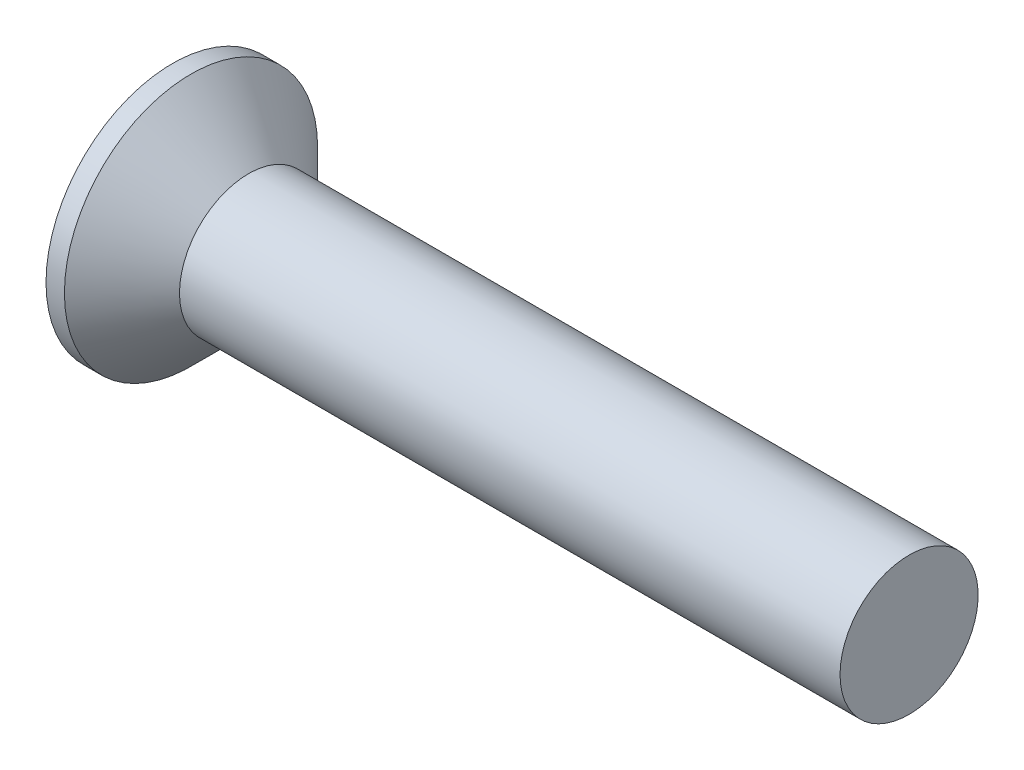
ISO-10303-21;
HEADER;
FILE_DESCRIPTION(('STEP AP214'),'2;1');
FILE_NAME('part.step','',(''),(''),'','','');
FILE_SCHEMA(('AUTOMOTIVE_DESIGN { 1 0 10303 214 1 1 1 1 }'));
ENDSEC;
DATA;
#1=APPLICATION_CONTEXT('core data for automotive mechanical design processes');
#2=APPLICATION_PROTOCOL_DEFINITION('international standard','automotive_design',2000,#1);
#3=PRODUCT_CONTEXT('',#1,'mechanical');
#4=PRODUCT('Part','Part','',(#3));
#5=PRODUCT_RELATED_PRODUCT_CATEGORY('part','',(#4));
#6=PRODUCT_DEFINITION_FORMATION('','',#4);
#7=PRODUCT_DEFINITION_CONTEXT('part definition',#1,'design');
#8=PRODUCT_DEFINITION('design','',#6,#7);
#9=PRODUCT_DEFINITION_SHAPE('','',#8);
#10=(LENGTH_UNIT() NAMED_UNIT(*) SI_UNIT(.MILLI.,.METRE.));
#11=(NAMED_UNIT(*) PLANE_ANGLE_UNIT() SI_UNIT($,.RADIAN.));
#12=(NAMED_UNIT(*) SI_UNIT($,.STERADIAN.) SOLID_ANGLE_UNIT());
#13=UNCERTAINTY_MEASURE_WITH_UNIT(LENGTH_MEASURE(1.E-05),#10,'distance_accuracy_value','');
#14=(GEOMETRIC_REPRESENTATION_CONTEXT(3) GLOBAL_UNCERTAINTY_ASSIGNED_CONTEXT((#13)) GLOBAL_UNIT_ASSIGNED_CONTEXT((#10,
#11,#12)) REPRESENTATION_CONTEXT('',''));
#15=CARTESIAN_POINT('',(0.,0.,0.));
#16=DIRECTION('',(0.,0.,1.));
#17=DIRECTION('',(1.,0.,0.));
#18=AXIS2_PLACEMENT_3D('',#15,#16,#17);
#19=CARTESIAN_POINT('',(0.,2.75,0.));
#20=DIRECTION('',(1.,0.,0.));
#21=DIRECTION('',(0.,0.,-1.));
#22=AXIS2_PLACEMENT_3D('',#19,#20,#21);
#23=PLANE('',#22);
#24=CARTESIAN_POINT('',(0.,0.,0.));
#25=DIRECTION('',(-1.,0.,0.));
#26=DIRECTION('',(0.,0.,1.));
#27=AXIS2_PLACEMENT_3D('',#24,#25,#26);
#28=CIRCLE('',#27,2.75);
#29=CARTESIAN_POINT('',(0.,0.,2.75));
#30=VERTEX_POINT('',#29);
#31=EDGE_CURVE('E45',#30,#30,#28,.T.);
#32=ORIENTED_EDGE('',*,*,#31,.T.);
#33=EDGE_LOOP('',(#32));
#34=FACE_BOUND('',#33,.T.);
#35=ADVANCED_FACE('F31',(#34),#23,.F.);
#36=CARTESIAN_POINT('',(16.,0.,0.));
#37=DIRECTION('',(-1.,0.,0.));
#38=DIRECTION('',(0.,0.,1.));
#39=AXIS2_PLACEMENT_3D('',#36,#37,#38);
#40=PLANE('',#39);
#41=CARTESIAN_POINT('',(16.,0.,0.));
#42=DIRECTION('',(-1.,0.,0.));
#43=DIRECTION('',(0.,0.,1.));
#44=AXIS2_PLACEMENT_3D('',#41,#42,#43);
#45=CIRCLE('',#44,1.5);
#46=CARTESIAN_POINT('',(16.,0.,1.5));
#47=VERTEX_POINT('',#46);
#48=EDGE_CURVE('E10',#47,#47,#45,.T.);
#49=ORIENTED_EDGE('',*,*,#48,.F.);
#50=EDGE_LOOP('',(#49));
#51=FACE_BOUND('',#50,.T.);
#52=ADVANCED_FACE('F65',(#51),#40,.F.);
#53=CARTESIAN_POINT('',(0.,0.,0.));
#54=DIRECTION('',(-1.,0.,0.));
#55=DIRECTION('',(0.,0.,1.));
#56=AXIS2_PLACEMENT_3D('',#53,#54,#55);
#57=CYLINDRICAL_SURFACE('',#56,1.5);
#58=CARTESIAN_POINT('',(1.65,0.,0.));
#59=DIRECTION('',(-1.,0.,0.));
#60=DIRECTION('',(0.,0.,1.));
#61=AXIS2_PLACEMENT_3D('',#58,#59,#60);
#62=CIRCLE('',#61,1.5);
#63=CARTESIAN_POINT('',(1.65,0.,1.5));
#64=VERTEX_POINT('',#63);
#65=EDGE_CURVE('E37',#64,#64,#62,.T.);
#66=ORIENTED_EDGE('',*,*,#65,.F.);
#67=EDGE_LOOP('',(#66));
#68=FACE_BOUND('',#67,.T.);
#69=ORIENTED_EDGE('',*,*,#48,.T.);
#70=EDGE_LOOP('',(#69));
#71=FACE_BOUND('',#70,.T.);
#72=ADVANCED_FACE('F60',(#68,#71),#57,.T.);
#73=CARTESIAN_POINT('',(1.65,0.,0.));
#74=DIRECTION('',(-1.,0.,0.));
#75=DIRECTION('',(0.,0.,1.));
#76=AXIS2_PLACEMENT_3D('',#73,#74,#75);
#77=CONICAL_SURFACE('',#76,1.5,0.78539816339745);
#78=CARTESIAN_POINT('',(0.400000000000003,0.,0.));
#79=DIRECTION('',(-1.,0.,0.));
#80=DIRECTION('',(0.,0.,1.));
#81=AXIS2_PLACEMENT_3D('',#78,#79,#80);
#82=CIRCLE('',#81,2.75);
#83=CARTESIAN_POINT('',(0.400000000000003,0.,2.75));
#84=VERTEX_POINT('',#83);
#85=EDGE_CURVE('E41',#84,#84,#82,.T.);
#86=ORIENTED_EDGE('',*,*,#85,.F.);
#87=EDGE_LOOP('',(#86));
#88=FACE_BOUND('',#87,.T.);
#89=ORIENTED_EDGE('',*,*,#65,.T.);
#90=EDGE_LOOP('',(#89));
#91=FACE_BOUND('',#90,.T.);
#92=ADVANCED_FACE('F55',(#88,#91),#77,.T.);
#93=CARTESIAN_POINT('',(0.,0.,0.));
#94=DIRECTION('',(-1.,0.,0.));
#95=DIRECTION('',(0.,0.,1.));
#96=AXIS2_PLACEMENT_3D('',#93,#94,#95);
#97=CYLINDRICAL_SURFACE('',#96,2.75);
#98=ORIENTED_EDGE('',*,*,#31,.F.);
#99=EDGE_LOOP('',(#98));
#100=FACE_BOUND('',#99,.T.);
#101=ORIENTED_EDGE('',*,*,#85,.T.);
#102=EDGE_LOOP('',(#101));
#103=FACE_BOUND('',#102,.T.);
#104=ADVANCED_FACE('F52',(#100,#103),#97,.T.);
#105=CLOSED_SHELL('',(#35,#52,#72,#92,#104));
#106=MANIFOLD_SOLID_BREP('B2',#105);
#107=ADVANCED_BREP_SHAPE_REPRESENTATION('',(#18,#106),#14);
#108=SHAPE_DEFINITION_REPRESENTATION(#9,#107);
ENDSEC;
END-ISO-10303-21;
